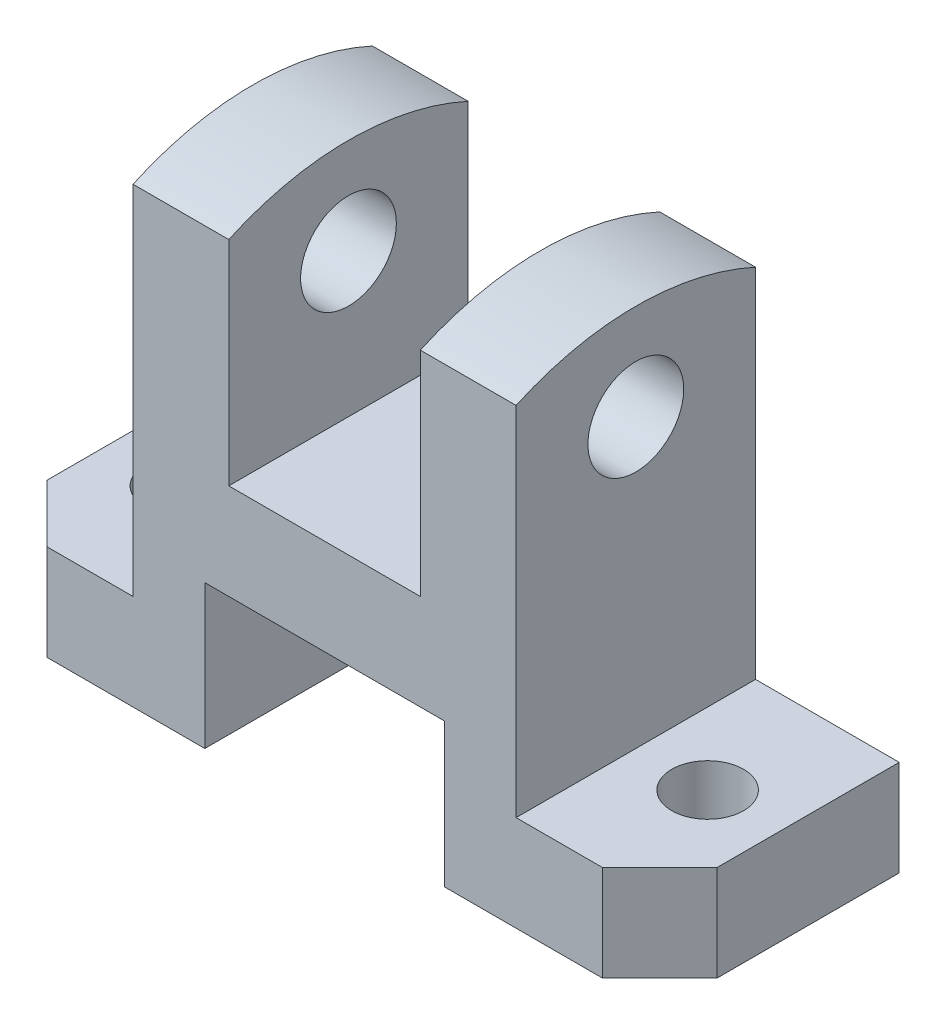
ISO-10303-21;
HEADER;
FILE_DESCRIPTION(('STEP AP214'),'2;1');
FILE_NAME('part.step','',(''),(''),'','','');
FILE_SCHEMA(('AUTOMOTIVE_DESIGN { 1 0 10303 214 1 1 1 1 }'));
ENDSEC;
DATA;
#1=APPLICATION_CONTEXT('core data for automotive mechanical design processes');
#2=APPLICATION_PROTOCOL_DEFINITION('international standard','automotive_design',2000,#1);
#3=PRODUCT_CONTEXT('',#1,'mechanical');
#4=PRODUCT('Part','Part','',(#3));
#5=PRODUCT_RELATED_PRODUCT_CATEGORY('part','',(#4));
#6=PRODUCT_DEFINITION_FORMATION('','',#4);
#7=PRODUCT_DEFINITION_CONTEXT('part definition',#1,'design');
#8=PRODUCT_DEFINITION('design','',#6,#7);
#9=PRODUCT_DEFINITION_SHAPE('','',#8);
#10=(LENGTH_UNIT() NAMED_UNIT(*) SI_UNIT(.MILLI.,.METRE.));
#11=(NAMED_UNIT(*) PLANE_ANGLE_UNIT() SI_UNIT($,.RADIAN.));
#12=(NAMED_UNIT(*) SI_UNIT($,.STERADIAN.) SOLID_ANGLE_UNIT());
#13=UNCERTAINTY_MEASURE_WITH_UNIT(LENGTH_MEASURE(1.E-05),#10,'distance_accuracy_value','');
#14=(GEOMETRIC_REPRESENTATION_CONTEXT(3) GLOBAL_UNCERTAINTY_ASSIGNED_CONTEXT((#13)) GLOBAL_UNIT_ASSIGNED_CONTEXT((#10,
#11,#12)) REPRESENTATION_CONTEXT('',''));
#15=CARTESIAN_POINT('',(0.,0.,0.));
#16=DIRECTION('',(0.,0.,1.));
#17=DIRECTION('',(1.,0.,0.));
#18=AXIS2_PLACEMENT_3D('',#15,#16,#17);
#19=CARTESIAN_POINT('',(41.275,0.,31.75));
#20=DIRECTION('',(-1.,0.,0.));
#21=DIRECTION('',(0.,0.,1.));
#22=AXIS2_PLACEMENT_3D('',#19,#20,#21);
#23=PLANE('',#22);
#24=CARTESIAN_POINT('',(41.275,-12.7,15.875));
#25=DIRECTION('',(1.,0.,0.));
#26=DIRECTION('',(0.,0.,-1.));
#27=AXIS2_PLACEMENT_3D('',#24,#25,#26);
#28=CIRCLE('',#27,6.35);
#29=CARTESIAN_POINT('',(41.275,-12.7,9.525));
#30=VERTEX_POINT('',#29);
#31=EDGE_CURVE('E161',#30,#30,#28,.T.);
#32=ORIENTED_EDGE('',*,*,#31,.F.);
#33=EDGE_LOOP('',(#32));
#34=FACE_BOUND('',#33,.T.);
#35=CARTESIAN_POINT('',(41.275,-38.1,15.875));
#36=DIRECTION('',(1.,0.,0.));
#37=DIRECTION('',(0.,0.,-1.));
#38=AXIS2_PLACEMENT_3D('',#35,#36,#37);
#39=CIRCLE('',#38,38.1);
#40=CARTESIAN_POINT('',(41.275,-3.46483903603161,31.75));
#41=VERTEX_POINT('',#40);
#42=CARTESIAN_POINT('',(41.275,-3.46483903603161,0.));
#43=VERTEX_POINT('',#42);
#44=EDGE_CURVE('E54',#41,#43,#39,.F.);
#45=ORIENTED_EDGE('',*,*,#44,.F.);
#46=DIRECTION('',(0.,1.,0.));
#47=VECTOR('',#46,1.);
#48=CARTESIAN_POINT('',(41.275,0.,31.75));
#49=LINE('',#48,#47);
#50=CARTESIAN_POINT('',(41.275,-50.8,31.75));
#51=VERTEX_POINT('',#50);
#52=EDGE_CURVE('E157',#51,#41,#49,.T.);
#53=ORIENTED_EDGE('',*,*,#52,.F.);
#54=DIRECTION('',(0.,0.,-1.));
#55=VECTOR('',#54,1.);
#56=CARTESIAN_POINT('',(41.275,-50.8,31.75));
#57=LINE('',#56,#55);
#58=CARTESIAN_POINT('',(41.275,-50.8,0.));
#59=VERTEX_POINT('',#58);
#60=EDGE_CURVE('E211',#51,#59,#57,.T.);
#61=ORIENTED_EDGE('',*,*,#60,.T.);
#62=DIRECTION('',(0.,1.,0.));
#63=VECTOR('',#62,1.);
#64=CARTESIAN_POINT('',(41.275,0.,0.));
#65=LINE('',#64,#63);
#66=EDGE_CURVE('E160',#59,#43,#65,.T.);
#67=ORIENTED_EDGE('',*,*,#66,.T.);
#68=EDGE_LOOP('',(#45,#53,#61,#67));
#69=FACE_BOUND('',#68,.T.);
#70=ADVANCED_FACE('F33',(#34,#69),#23,.F.);
#71=CARTESIAN_POINT('',(28.575,0.,31.75));
#72=DIRECTION('',(1.,0.,0.));
#73=DIRECTION('',(0.,0.,-1.));
#74=AXIS2_PLACEMENT_3D('',#71,#72,#73);
#75=PLANE('',#74);
#76=CARTESIAN_POINT('',(28.575,-12.7,15.875));
#77=DIRECTION('',(1.,0.,0.));
#78=DIRECTION('',(0.,0.,-1.));
#79=AXIS2_PLACEMENT_3D('',#76,#77,#78);
#80=CIRCLE('',#79,6.35);
#81=CARTESIAN_POINT('',(28.575,-12.7,9.525));
#82=VERTEX_POINT('',#81);
#83=EDGE_CURVE('E287',#82,#82,#80,.T.);
#84=ORIENTED_EDGE('',*,*,#83,.T.);
#85=EDGE_LOOP('',(#84));
#86=FACE_BOUND('',#85,.T.);
#87=DIRECTION('',(0.,-1.,0.));
#88=VECTOR('',#87,1.);
#89=CARTESIAN_POINT('',(28.575,0.,31.75));
#90=LINE('',#89,#88);
#91=CARTESIAN_POINT('',(28.575,-3.46483903603161,31.75));
#92=VERTEX_POINT('',#91);
#93=CARTESIAN_POINT('',(28.575,-31.75,31.75));
#94=VERTEX_POINT('',#93);
#95=EDGE_CURVE('E175',#92,#94,#90,.T.);
#96=ORIENTED_EDGE('',*,*,#95,.F.);
#97=CARTESIAN_POINT('',(28.575,-38.1,15.875));
#98=DIRECTION('',(1.,0.,0.));
#99=DIRECTION('',(0.,0.,-1.));
#100=AXIS2_PLACEMENT_3D('',#97,#98,#99);
#101=CIRCLE('',#100,38.1);
#102=CARTESIAN_POINT('',(28.575,-3.46483903603161,0.));
#103=VERTEX_POINT('',#102);
#104=EDGE_CURVE('E166',#92,#103,#101,.F.);
#105=ORIENTED_EDGE('',*,*,#104,.T.);
#106=DIRECTION('',(0.,-1.,0.));
#107=VECTOR('',#106,1.);
#108=CARTESIAN_POINT('',(28.575,0.,0.));
#109=LINE('',#108,#107);
#110=CARTESIAN_POINT('',(28.575,-31.75,0.));
#111=VERTEX_POINT('',#110);
#112=EDGE_CURVE('E213',#103,#111,#109,.T.);
#113=ORIENTED_EDGE('',*,*,#112,.T.);
#114=DIRECTION('',(0.,0.,-1.));
#115=VECTOR('',#114,1.);
#116=CARTESIAN_POINT('',(28.575,-31.75,31.75));
#117=LINE('',#116,#115);
#118=EDGE_CURVE('E268',#94,#111,#117,.T.);
#119=ORIENTED_EDGE('',*,*,#118,.F.);
#120=EDGE_LOOP('',(#96,#105,#113,#119));
#121=FACE_BOUND('',#120,.T.);
#122=ADVANCED_FACE('F356',(#86,#121),#75,.F.);
#123=CARTESIAN_POINT('',(3.175,0.,31.75));
#124=DIRECTION('',(1.,0.,0.));
#125=DIRECTION('',(0.,0.,-1.));
#126=AXIS2_PLACEMENT_3D('',#123,#124,#125);
#127=PLANE('',#126);
#128=CARTESIAN_POINT('',(3.175,-12.7,15.875));
#129=DIRECTION('',(1.,0.,0.));
#130=DIRECTION('',(0.,0.,-1.));
#131=AXIS2_PLACEMENT_3D('',#128,#129,#130);
#132=CIRCLE('',#131,6.35);
#133=CARTESIAN_POINT('',(3.175,-12.7,9.525));
#134=VERTEX_POINT('',#133);
#135=EDGE_CURVE('E283',#134,#134,#132,.T.);
#136=ORIENTED_EDGE('',*,*,#135,.F.);
#137=EDGE_LOOP('',(#136));
#138=FACE_BOUND('',#137,.T.);
#139=CARTESIAN_POINT('',(3.175,-38.1,15.875));
#140=DIRECTION('',(1.,0.,0.));
#141=DIRECTION('',(0.,0.,-1.));
#142=AXIS2_PLACEMENT_3D('',#139,#140,#141);
#143=CIRCLE('',#142,38.1);
#144=CARTESIAN_POINT('',(3.175,-3.46483903603161,31.75));
#145=VERTEX_POINT('',#144);
#146=CARTESIAN_POINT('',(3.175,-3.46483903603161,0.));
#147=VERTEX_POINT('',#146);
#148=EDGE_CURVE('E46',#145,#147,#143,.F.);
#149=ORIENTED_EDGE('',*,*,#148,.F.);
#150=DIRECTION('',(0.,-1.,0.));
#151=VECTOR('',#150,1.);
#152=CARTESIAN_POINT('',(3.175,0.,31.75));
#153=LINE('',#152,#151);
#154=CARTESIAN_POINT('',(3.175,-31.75,31.75));
#155=VERTEX_POINT('',#154);
#156=EDGE_CURVE('E189',#145,#155,#153,.T.);
#157=ORIENTED_EDGE('',*,*,#156,.T.);
#158=DIRECTION('',(0.,0.,-1.));
#159=VECTOR('',#158,1.);
#160=CARTESIAN_POINT('',(3.175,-31.75,31.75));
#161=LINE('',#160,#159);
#162=CARTESIAN_POINT('',(3.175,-31.75,0.));
#163=VERTEX_POINT('',#162);
#164=EDGE_CURVE('E265',#155,#163,#161,.T.);
#165=ORIENTED_EDGE('',*,*,#164,.T.);
#166=DIRECTION('',(0.,-1.,0.));
#167=VECTOR('',#166,1.);
#168=CARTESIAN_POINT('',(3.175,0.,0.));
#169=LINE('',#168,#167);
#170=EDGE_CURVE('E218',#147,#163,#169,.T.);
#171=ORIENTED_EDGE('',*,*,#170,.F.);
#172=EDGE_LOOP('',(#149,#157,#165,#171));
#173=FACE_BOUND('',#172,.T.);
#174=ADVANCED_FACE('F364',(#138,#173),#127,.T.);
#175=CARTESIAN_POINT('',(-9.525,0.,31.75));
#176=DIRECTION('',(1.,0.,0.));
#177=DIRECTION('',(0.,0.,-1.));
#178=AXIS2_PLACEMENT_3D('',#175,#176,#177);
#179=PLANE('',#178);
#180=CARTESIAN_POINT('',(-9.525,-12.7,15.875));
#181=DIRECTION('',(1.,0.,0.));
#182=DIRECTION('',(0.,0.,-1.));
#183=AXIS2_PLACEMENT_3D('',#180,#181,#182);
#184=CIRCLE('',#183,6.35);
#185=CARTESIAN_POINT('',(-9.525,-12.7,9.525));
#186=VERTEX_POINT('',#185);
#187=EDGE_CURVE('E281',#186,#186,#184,.T.);
#188=ORIENTED_EDGE('',*,*,#187,.T.);
#189=EDGE_LOOP('',(#188));
#190=FACE_BOUND('',#189,.T.);
#191=DIRECTION('',(0.,-1.,0.));
#192=VECTOR('',#191,1.);
#193=CARTESIAN_POINT('',(-9.525,0.,31.75));
#194=LINE('',#193,#192);
#195=CARTESIAN_POINT('',(-9.525,-3.46483903603161,31.75));
#196=VERTEX_POINT('',#195);
#197=CARTESIAN_POINT('',(-9.525,-50.8,31.75));
#198=VERTEX_POINT('',#197);
#199=EDGE_CURVE('E191',#196,#198,#194,.T.);
#200=ORIENTED_EDGE('',*,*,#199,.F.);
#201=CARTESIAN_POINT('',(-9.525,-38.1,15.875));
#202=DIRECTION('',(1.,0.,0.));
#203=DIRECTION('',(0.,0.,-1.));
#204=AXIS2_PLACEMENT_3D('',#201,#202,#203);
#205=CIRCLE('',#204,38.1);
#206=CARTESIAN_POINT('',(-9.525,-3.46483903603161,0.));
#207=VERTEX_POINT('',#206);
#208=EDGE_CURVE('E292',#196,#207,#205,.F.);
#209=ORIENTED_EDGE('',*,*,#208,.T.);
#210=DIRECTION('',(0.,-1.,0.));
#211=VECTOR('',#210,1.);
#212=CARTESIAN_POINT('',(-9.525,0.,0.));
#213=LINE('',#212,#211);
#214=CARTESIAN_POINT('',(-9.525,-50.8,0.));
#215=VERTEX_POINT('',#214);
#216=EDGE_CURVE('E220',#207,#215,#213,.T.);
#217=ORIENTED_EDGE('',*,*,#216,.T.);
#218=DIRECTION('',(0.,0.,-1.));
#219=VECTOR('',#218,1.);
#220=CARTESIAN_POINT('',(-9.525,-50.8,31.75));
#221=LINE('',#220,#219);
#222=EDGE_CURVE('E262',#198,#215,#221,.T.);
#223=ORIENTED_EDGE('',*,*,#222,.F.);
#224=EDGE_LOOP('',(#200,#209,#217,#223));
#225=FACE_BOUND('',#224,.T.);
#226=ADVANCED_FACE('F384',(#190,#225),#179,.F.);
#227=CARTESIAN_POINT('',(0.,-31.75,31.75));
#228=DIRECTION('',(0.,1.,0.));
#229=DIRECTION('',(0.,0.,1.));
#230=AXIS2_PLACEMENT_3D('',#227,#228,#229);
#231=PLANE('',#230);
#232=DIRECTION('',(1.,0.,0.));
#233=VECTOR('',#232,1.);
#234=CARTESIAN_POINT('',(0.,-31.75,0.));
#235=LINE('',#234,#233);
#236=EDGE_CURVE('E215',#163,#111,#235,.T.);
#237=ORIENTED_EDGE('',*,*,#236,.F.);
#238=ORIENTED_EDGE('',*,*,#164,.F.);
#239=DIRECTION('',(1.,0.,0.));
#240=VECTOR('',#239,1.);
#241=CARTESIAN_POINT('',(0.,-31.75,31.75));
#242=LINE('',#241,#240);
#243=EDGE_CURVE('E178',#155,#94,#242,.T.);
#244=ORIENTED_EDGE('',*,*,#243,.T.);
#245=ORIENTED_EDGE('',*,*,#118,.T.);
#246=EDGE_LOOP('',(#237,#238,#244,#245));
#247=FACE_BOUND('',#246,.T.);
#248=ADVANCED_FACE('F358',(#247),#231,.T.);
#249=CARTESIAN_POINT('',(0.,-50.8,31.75));
#250=DIRECTION('',(0.,-1.,0.));
#251=DIRECTION('',(0.,0.,-1.));
#252=AXIS2_PLACEMENT_3D('',#249,#250,#251);
#253=PLANE('',#252);
#254=CARTESIAN_POINT('',(-19.05,-50.8,15.875));
#255=DIRECTION('',(0.,1.,0.));
#256=DIRECTION('',(0.,0.,1.));
#257=AXIS2_PLACEMENT_3D('',#254,#255,#256);
#258=CIRCLE('',#257,4.7625);
#259=CARTESIAN_POINT('',(-19.05,-50.8,20.6375));
#260=VERTEX_POINT('',#259);
#261=EDGE_CURVE('E299',#260,#260,#258,.T.);
#262=ORIENTED_EDGE('',*,*,#261,.F.);
#263=EDGE_LOOP('',(#262));
#264=FACE_BOUND('',#263,.T.);
#265=DIRECTION('',(0.,0.,-1.));
#266=VECTOR('',#265,1.);
#267=CARTESIAN_POINT('',(-28.575,-50.8,31.75));
#268=LINE('',#267,#266);
#269=CARTESIAN_POINT('',(-28.575,-50.8,24.13));
#270=VERTEX_POINT('',#269);
#271=CARTESIAN_POINT('',(-28.575,-50.8,0.));
#272=VERTEX_POINT('',#271);
#273=EDGE_CURVE('E260',#270,#272,#268,.T.);
#274=ORIENTED_EDGE('',*,*,#273,.F.);
#275=DIRECTION('',(-0.707106781186548,0.,-0.707106781186547));
#276=VECTOR('',#275,1.);
#277=CARTESIAN_POINT('',(-20.955,-50.8,31.75));
#278=LINE('',#277,#276);
#279=CARTESIAN_POINT('',(-20.955,-50.8,31.75));
#280=VERTEX_POINT('',#279);
#281=EDGE_CURVE('E306',#280,#270,#278,.T.);
#282=ORIENTED_EDGE('',*,*,#281,.F.);
#283=DIRECTION('',(-1.,0.,0.));
#284=VECTOR('',#283,1.);
#285=CARTESIAN_POINT('',(0.,-50.8,31.75));
#286=LINE('',#285,#284);
#287=EDGE_CURVE('E193',#198,#280,#286,.T.);
#288=ORIENTED_EDGE('',*,*,#287,.F.);
#289=ORIENTED_EDGE('',*,*,#222,.T.);
#290=DIRECTION('',(-1.,0.,0.));
#291=VECTOR('',#290,1.);
#292=CARTESIAN_POINT('',(0.,-50.8,0.));
#293=LINE('',#292,#291);
#294=EDGE_CURVE('E222',#215,#272,#293,.T.);
#295=ORIENTED_EDGE('',*,*,#294,.T.);
#296=EDGE_LOOP('',(#274,#282,#288,#289,#295));
#297=FACE_BOUND('',#296,.T.);
#298=ADVANCED_FACE('F389',(#264,#297),#253,.F.);
#299=CARTESIAN_POINT('',(-28.575,0.,31.75));
#300=DIRECTION('',(-1.,0.,0.));
#301=DIRECTION('',(0.,-1.,0.));
#302=AXIS2_PLACEMENT_3D('',#299,#300,#301);
#303=PLANE('',#302);
#304=DIRECTION('',(0.,1.,0.));
#305=VECTOR('',#304,1.);
#306=CARTESIAN_POINT('',(-28.575,-82.55,24.13));
#307=LINE('',#306,#305);
#308=CARTESIAN_POINT('',(-28.575,-63.5,24.13));
#309=VERTEX_POINT('',#308);
#310=EDGE_CURVE('E308',#309,#270,#307,.T.);
#311=ORIENTED_EDGE('',*,*,#310,.T.);
#312=ORIENTED_EDGE('',*,*,#273,.T.);
#313=DIRECTION('',(0.,1.,0.));
#314=VECTOR('',#313,1.);
#315=CARTESIAN_POINT('',(-28.575,0.,0.));
#316=LINE('',#315,#314);
#317=CARTESIAN_POINT('',(-28.575,-63.5,0.));
#318=VERTEX_POINT('',#317);
#319=EDGE_CURVE('E225',#318,#272,#316,.T.);
#320=ORIENTED_EDGE('',*,*,#319,.F.);
#321=DIRECTION('',(0.,0.,-1.));
#322=VECTOR('',#321,1.);
#323=CARTESIAN_POINT('',(-28.575,-63.5,31.75));
#324=LINE('',#323,#322);
#325=EDGE_CURVE('E258',#309,#318,#324,.T.);
#326=ORIENTED_EDGE('',*,*,#325,.F.);
#327=EDGE_LOOP('',(#311,#312,#320,#326));
#328=FACE_BOUND('',#327,.T.);
#329=ADVANCED_FACE('F395',(#328),#303,.T.);
#330=CARTESIAN_POINT('',(0.,-63.5,31.75));
#331=DIRECTION('',(0.,-1.,0.));
#332=DIRECTION('',(1.,0.,0.));
#333=AXIS2_PLACEMENT_3D('',#330,#331,#332);
#334=PLANE('',#333);
#335=CARTESIAN_POINT('',(-19.05,-63.5,15.875));
#336=DIRECTION('',(0.,-1.,0.));
#337=DIRECTION('',(1.,0.,0.));
#338=AXIS2_PLACEMENT_3D('',#335,#336,#337);
#339=CIRCLE('',#338,4.7625);
#340=CARTESIAN_POINT('',(-14.2875,-63.5,15.875));
#341=VERTEX_POINT('',#340);
#342=EDGE_CURVE('E276',#341,#341,#339,.T.);
#343=ORIENTED_EDGE('',*,*,#342,.F.);
#344=EDGE_LOOP('',(#343));
#345=FACE_BOUND('',#344,.T.);
#346=DIRECTION('',(0.707106781186548,0.,0.707106781186547));
#347=VECTOR('',#346,1.);
#348=CARTESIAN_POINT('',(-10.4775,-63.5,42.2275));
#349=LINE('',#348,#347);
#350=CARTESIAN_POINT('',(-20.955,-63.5,31.75));
#351=VERTEX_POINT('',#350);
#352=EDGE_CURVE('E184',#309,#351,#349,.T.);
#353=ORIENTED_EDGE('',*,*,#352,.F.);
#354=ORIENTED_EDGE('',*,*,#325,.T.);
#355=DIRECTION('',(-1.,0.,0.));
#356=VECTOR('',#355,1.);
#357=CARTESIAN_POINT('',(0.,-63.5,0.));
#358=LINE('',#357,#356);
#359=CARTESIAN_POINT('',(0.,-63.5,0.));
#360=VERTEX_POINT('',#359);
#361=EDGE_CURVE('E228',#360,#318,#358,.T.);
#362=ORIENTED_EDGE('',*,*,#361,.F.);
#363=DIRECTION('',(0.,0.,-1.));
#364=VECTOR('',#363,1.);
#365=CARTESIAN_POINT('',(0.,-63.5,31.75));
#366=LINE('',#365,#364);
#367=CARTESIAN_POINT('',(0.,-63.5,31.75));
#368=VERTEX_POINT('',#367);
#369=EDGE_CURVE('E256',#368,#360,#366,.T.);
#370=ORIENTED_EDGE('',*,*,#369,.F.);
#371=DIRECTION('',(-1.,0.,0.));
#372=VECTOR('',#371,1.);
#373=CARTESIAN_POINT('',(0.,-63.5,31.75));
#374=LINE('',#373,#372);
#375=EDGE_CURVE('E196',#368,#351,#374,.T.);
#376=ORIENTED_EDGE('',*,*,#375,.T.);
#377=EDGE_LOOP('',(#353,#354,#362,#370,#376));
#378=FACE_BOUND('',#377,.T.);
#379=ADVANCED_FACE('F328',(#345,#378),#334,.T.);
#380=CARTESIAN_POINT('',(0.,0.,31.75));
#381=DIRECTION('',(1.,0.,0.));
#382=DIRECTION('',(0.,1.,0.));
#383=AXIS2_PLACEMENT_3D('',#380,#381,#382);
#384=PLANE('',#383);
#385=DIRECTION('',(0.,-1.,0.));
#386=VECTOR('',#385,1.);
#387=CARTESIAN_POINT('',(0.,0.,0.));
#388=LINE('',#387,#386);
#389=CARTESIAN_POINT('',(0.,-44.45,0.));
#390=VERTEX_POINT('',#389);
#391=EDGE_CURVE('E231',#390,#360,#388,.T.);
#392=ORIENTED_EDGE('',*,*,#391,.F.);
#393=DIRECTION('',(0.,0.,-1.));
#394=VECTOR('',#393,1.);
#395=CARTESIAN_POINT('',(0.,-44.45,31.75));
#396=LINE('',#395,#394);
#397=CARTESIAN_POINT('',(0.,-44.45,31.75));
#398=VERTEX_POINT('',#397);
#399=EDGE_CURVE('E254',#398,#390,#396,.T.);
#400=ORIENTED_EDGE('',*,*,#399,.F.);
#401=DIRECTION('',(0.,-1.,0.));
#402=VECTOR('',#401,1.);
#403=CARTESIAN_POINT('',(0.,0.,31.75));
#404=LINE('',#403,#402);
#405=EDGE_CURVE('E199',#398,#368,#404,.T.);
#406=ORIENTED_EDGE('',*,*,#405,.T.);
#407=ORIENTED_EDGE('',*,*,#369,.T.);
#408=EDGE_LOOP('',(#392,#400,#406,#407));
#409=FACE_BOUND('',#408,.T.);
#410=ADVANCED_FACE('F332',(#409),#384,.T.);
#411=CARTESIAN_POINT('',(0.,-44.45,31.75));
#412=DIRECTION('',(0.,1.,0.));
#413=DIRECTION('',(-1.,0.,0.));
#414=AXIS2_PLACEMENT_3D('',#411,#412,#413);
#415=PLANE('',#414);
#416=DIRECTION('',(1.,0.,0.));
#417=VECTOR('',#416,1.);
#418=CARTESIAN_POINT('',(0.,-44.45,0.));
#419=LINE('',#418,#417);
#420=CARTESIAN_POINT('',(31.75,-44.45,0.));
#421=VERTEX_POINT('',#420);
#422=EDGE_CURVE('E234',#390,#421,#419,.T.);
#423=ORIENTED_EDGE('',*,*,#422,.T.);
#424=DIRECTION('',(0.,0.,-1.));
#425=VECTOR('',#424,1.);
#426=CARTESIAN_POINT('',(31.75,-44.45,31.75));
#427=LINE('',#426,#425);
#428=CARTESIAN_POINT('',(31.75,-44.45,31.75));
#429=VERTEX_POINT('',#428);
#430=EDGE_CURVE('E252',#429,#421,#427,.T.);
#431=ORIENTED_EDGE('',*,*,#430,.F.);
#432=DIRECTION('',(1.,0.,0.));
#433=VECTOR('',#432,1.);
#434=CARTESIAN_POINT('',(0.,-44.45,31.75));
#435=LINE('',#434,#433);
#436=EDGE_CURVE('E202',#398,#429,#435,.T.);
#437=ORIENTED_EDGE('',*,*,#436,.F.);
#438=ORIENTED_EDGE('',*,*,#399,.T.);
#439=EDGE_LOOP('',(#423,#431,#437,#438));
#440=FACE_BOUND('',#439,.T.);
#441=ADVANCED_FACE('F337',(#440),#415,.F.);
#442=CARTESIAN_POINT('',(31.75,0.,31.75));
#443=DIRECTION('',(-1.,0.,0.));
#444=DIRECTION('',(0.,-1.,0.));
#445=AXIS2_PLACEMENT_3D('',#442,#443,#444);
#446=PLANE('',#445);
#447=DIRECTION('',(0.,1.,0.));
#448=VECTOR('',#447,1.);
#449=CARTESIAN_POINT('',(31.75,0.,0.));
#450=LINE('',#449,#448);
#451=CARTESIAN_POINT('',(31.75,-63.5,0.));
#452=VERTEX_POINT('',#451);
#453=EDGE_CURVE('E237',#452,#421,#450,.T.);
#454=ORIENTED_EDGE('',*,*,#453,.F.);
#455=DIRECTION('',(0.,0.,-1.));
#456=VECTOR('',#455,1.);
#457=CARTESIAN_POINT('',(31.75,-63.5,31.75));
#458=LINE('',#457,#456);
#459=CARTESIAN_POINT('',(31.75,-63.5,31.75));
#460=VERTEX_POINT('',#459);
#461=EDGE_CURVE('E250',#460,#452,#458,.T.);
#462=ORIENTED_EDGE('',*,*,#461,.F.);
#463=DIRECTION('',(0.,1.,0.));
#464=VECTOR('',#463,1.);
#465=CARTESIAN_POINT('',(31.75,0.,31.75));
#466=LINE('',#465,#464);
#467=EDGE_CURVE('E204',#460,#429,#466,.T.);
#468=ORIENTED_EDGE('',*,*,#467,.T.);
#469=ORIENTED_EDGE('',*,*,#430,.T.);
#470=EDGE_LOOP('',(#454,#462,#468,#469));
#471=FACE_BOUND('',#470,.T.);
#472=ADVANCED_FACE('F341',(#471),#446,.T.);
#473=CARTESIAN_POINT('',(0.,-63.5,31.75));
#474=DIRECTION('',(0.,1.,0.));
#475=DIRECTION('',(0.,0.,1.));
#476=AXIS2_PLACEMENT_3D('',#473,#474,#475);
#477=PLANE('',#476);
#478=CARTESIAN_POINT('',(50.8,-63.5,15.875));
#479=DIRECTION('',(0.,1.,0.));
#480=DIRECTION('',(0.,0.,1.));
#481=AXIS2_PLACEMENT_3D('',#478,#479,#480);
#482=CIRCLE('',#481,4.7625);
#483=CARTESIAN_POINT('',(50.8,-63.5,20.6375));
#484=VERTEX_POINT('',#483);
#485=EDGE_CURVE('E280',#484,#484,#482,.T.);
#486=ORIENTED_EDGE('',*,*,#485,.T.);
#487=EDGE_LOOP('',(#486));
#488=FACE_BOUND('',#487,.T.);
#489=DIRECTION('',(0.,0.,-1.));
#490=VECTOR('',#489,1.);
#491=CARTESIAN_POINT('',(60.325,-63.5,31.75));
#492=LINE('',#491,#490);
#493=CARTESIAN_POINT('',(60.325,-63.5,24.13));
#494=VERTEX_POINT('',#493);
#495=CARTESIAN_POINT('',(60.325,-63.5,0.));
#496=VERTEX_POINT('',#495);
#497=EDGE_CURVE('E248',#494,#496,#492,.T.);
#498=ORIENTED_EDGE('',*,*,#497,.F.);
#499=DIRECTION('',(-0.707106781186548,0.,0.707106781186547));
#500=VECTOR('',#499,1.);
#501=CARTESIAN_POINT('',(26.3525,-63.5,58.1025));
#502=LINE('',#501,#500);
#503=CARTESIAN_POINT('',(52.705,-63.5,31.75));
#504=VERTEX_POINT('',#503);
#505=EDGE_CURVE('E312',#494,#504,#502,.T.);
#506=ORIENTED_EDGE('',*,*,#505,.T.);
#507=DIRECTION('',(1.,0.,0.));
#508=VECTOR('',#507,1.);
#509=CARTESIAN_POINT('',(0.,-63.5,31.75));
#510=LINE('',#509,#508);
#511=EDGE_CURVE('E207',#460,#504,#510,.T.);
#512=ORIENTED_EDGE('',*,*,#511,.F.);
#513=ORIENTED_EDGE('',*,*,#461,.T.);
#514=DIRECTION('',(1.,0.,0.));
#515=VECTOR('',#514,1.);
#516=CARTESIAN_POINT('',(0.,-63.5,0.));
#517=LINE('',#516,#515);
#518=EDGE_CURVE('E240',#452,#496,#517,.T.);
#519=ORIENTED_EDGE('',*,*,#518,.T.);
#520=EDGE_LOOP('',(#498,#506,#512,#513,#519));
#521=FACE_BOUND('',#520,.T.);
#522=ADVANCED_FACE('F343',(#488,#521),#477,.F.);
#523=CARTESIAN_POINT('',(60.325,0.,31.75));
#524=DIRECTION('',(-1.,0.,0.));
#525=DIRECTION('',(0.,-1.,0.));
#526=AXIS2_PLACEMENT_3D('',#523,#524,#525);
#527=PLANE('',#526);
#528=DIRECTION('',(0.,0.,-1.));
#529=VECTOR('',#528,1.);
#530=CARTESIAN_POINT('',(60.325,-50.8,31.75));
#531=LINE('',#530,#529);
#532=CARTESIAN_POINT('',(60.325,-50.8,24.13));
#533=VERTEX_POINT('',#532);
#534=CARTESIAN_POINT('',(60.325,-50.8,0.));
#535=VERTEX_POINT('',#534);
#536=EDGE_CURVE('E246',#533,#535,#531,.T.);
#537=ORIENTED_EDGE('',*,*,#536,.F.);
#538=DIRECTION('',(0.,1.,0.));
#539=VECTOR('',#538,1.);
#540=CARTESIAN_POINT('',(60.325,-82.55,24.13));
#541=LINE('',#540,#539);
#542=EDGE_CURVE('E309',#494,#533,#541,.T.);
#543=ORIENTED_EDGE('',*,*,#542,.F.);
#544=ORIENTED_EDGE('',*,*,#497,.T.);
#545=DIRECTION('',(0.,1.,0.));
#546=VECTOR('',#545,1.);
#547=CARTESIAN_POINT('',(60.325,0.,0.));
#548=LINE('',#547,#546);
#549=EDGE_CURVE('E181',#496,#535,#548,.T.);
#550=ORIENTED_EDGE('',*,*,#549,.T.);
#551=EDGE_LOOP('',(#537,#543,#544,#550));
#552=FACE_BOUND('',#551,.T.);
#553=ADVANCED_FACE('F411',(#552),#527,.F.);
#554=CARTESIAN_POINT('',(0.,-50.8,31.75));
#555=DIRECTION('',(0.,1.,0.));
#556=DIRECTION('',(0.,0.,1.));
#557=AXIS2_PLACEMENT_3D('',#554,#555,#556);
#558=PLANE('',#557);
#559=CARTESIAN_POINT('',(50.8,-50.8,15.875));
#560=DIRECTION('',(0.,1.,0.));
#561=DIRECTION('',(0.,0.,1.));
#562=AXIS2_PLACEMENT_3D('',#559,#560,#561);
#563=CIRCLE('',#562,4.7625);
#564=CARTESIAN_POINT('',(50.8,-50.8,20.6375));
#565=VERTEX_POINT('',#564);
#566=EDGE_CURVE('E298',#565,#565,#563,.T.);
#567=ORIENTED_EDGE('',*,*,#566,.F.);
#568=EDGE_LOOP('',(#567));
#569=FACE_BOUND('',#568,.T.);
#570=DIRECTION('',(-0.707106781186548,0.,0.707106781186547));
#571=VECTOR('',#570,1.);
#572=CARTESIAN_POINT('',(52.705,-50.8,31.75));
#573=LINE('',#572,#571);
#574=CARTESIAN_POINT('',(52.705,-50.8,31.75));
#575=VERTEX_POINT('',#574);
#576=EDGE_CURVE('E279',#533,#575,#573,.T.);
#577=ORIENTED_EDGE('',*,*,#576,.F.);
#578=ORIENTED_EDGE('',*,*,#536,.T.);
#579=DIRECTION('',(1.,0.,0.));
#580=VECTOR('',#579,1.);
#581=CARTESIAN_POINT('',(0.,-50.8,0.));
#582=LINE('',#581,#580);
#583=EDGE_CURVE('E176',#59,#535,#582,.T.);
#584=ORIENTED_EDGE('',*,*,#583,.F.);
#585=ORIENTED_EDGE('',*,*,#60,.F.);
#586=DIRECTION('',(1.,0.,0.));
#587=VECTOR('',#586,1.);
#588=CARTESIAN_POINT('',(0.,-50.8,31.75));
#589=LINE('',#588,#587);
#590=EDGE_CURVE('E174',#51,#575,#589,.T.);
#591=ORIENTED_EDGE('',*,*,#590,.T.);
#592=EDGE_LOOP('',(#577,#578,#584,#585,#591));
#593=FACE_BOUND('',#592,.T.);
#594=ADVANCED_FACE('F347',(#569,#593),#558,.T.);
#595=CARTESIAN_POINT('',(0.,0.,31.75));
#596=DIRECTION('',(0.,0.,1.));
#597=DIRECTION('',(1.,0.,0.));
#598=AXIS2_PLACEMENT_3D('',#595,#596,#597);
#599=PLANE('',#598);
#600=DIRECTION('',(1.,0.,0.));
#601=VECTOR('',#600,1.);
#602=CARTESIAN_POINT('',(-28.575,-3.46483903603161,31.75));
#603=LINE('',#602,#601);
#604=EDGE_CURVE('E11',#196,#145,#603,.T.);
#605=ORIENTED_EDGE('',*,*,#604,.F.);
#606=ORIENTED_EDGE('',*,*,#199,.T.);
#607=ORIENTED_EDGE('',*,*,#287,.T.);
#608=DIRECTION('',(0.,1.,0.));
#609=VECTOR('',#608,1.);
#610=CARTESIAN_POINT('',(-20.955,0.,31.75));
#611=LINE('',#610,#609);
#612=EDGE_CURVE('E273',#351,#280,#611,.T.);
#613=ORIENTED_EDGE('',*,*,#612,.F.);
#614=ORIENTED_EDGE('',*,*,#375,.F.);
#615=ORIENTED_EDGE('',*,*,#405,.F.);
#616=ORIENTED_EDGE('',*,*,#436,.T.);
#617=ORIENTED_EDGE('',*,*,#467,.F.);
#618=ORIENTED_EDGE('',*,*,#511,.T.);
#619=DIRECTION('',(0.,-1.,0.));
#620=VECTOR('',#619,1.);
#621=CARTESIAN_POINT('',(52.705,0.,31.75));
#622=LINE('',#621,#620);
#623=EDGE_CURVE('E271',#575,#504,#622,.T.);
#624=ORIENTED_EDGE('',*,*,#623,.F.);
#625=ORIENTED_EDGE('',*,*,#590,.F.);
#626=ORIENTED_EDGE('',*,*,#52,.T.);
#627=EDGE_CURVE('E36',#92,#41,#603,.T.);
#628=ORIENTED_EDGE('',*,*,#627,.F.);
#629=ORIENTED_EDGE('',*,*,#95,.T.);
#630=ORIENTED_EDGE('',*,*,#243,.F.);
#631=ORIENTED_EDGE('',*,*,#156,.F.);
#632=EDGE_LOOP('',(#605,#606,#607,#613,#614,#615,#616,#617,#618,#624,#625,#626,#628,#629,#630,#631));
#633=FACE_BOUND('',#632,.T.);
#634=ADVANCED_FACE('F171',(#633),#599,.T.);
#635=CARTESIAN_POINT('',(0.,0.,0.));
#636=DIRECTION('',(0.,0.,1.));
#637=DIRECTION('',(1.,0.,0.));
#638=AXIS2_PLACEMENT_3D('',#635,#636,#637);
#639=PLANE('',#638);
#640=ORIENTED_EDGE('',*,*,#216,.F.);
#641=DIRECTION('',(1.,0.,0.));
#642=VECTOR('',#641,1.);
#643=CARTESIAN_POINT('',(-28.575,-3.46483903603161,0.));
#644=LINE('',#643,#642);
#645=EDGE_CURVE('E169',#207,#147,#644,.T.);
#646=ORIENTED_EDGE('',*,*,#645,.T.);
#647=ORIENTED_EDGE('',*,*,#170,.T.);
#648=ORIENTED_EDGE('',*,*,#236,.T.);
#649=ORIENTED_EDGE('',*,*,#112,.F.);
#650=EDGE_CURVE('E275',#103,#43,#644,.T.);
#651=ORIENTED_EDGE('',*,*,#650,.T.);
#652=ORIENTED_EDGE('',*,*,#66,.F.);
#653=ORIENTED_EDGE('',*,*,#583,.T.);
#654=ORIENTED_EDGE('',*,*,#549,.F.);
#655=ORIENTED_EDGE('',*,*,#518,.F.);
#656=ORIENTED_EDGE('',*,*,#453,.T.);
#657=ORIENTED_EDGE('',*,*,#422,.F.);
#658=ORIENTED_EDGE('',*,*,#391,.T.);
#659=ORIENTED_EDGE('',*,*,#361,.T.);
#660=ORIENTED_EDGE('',*,*,#319,.T.);
#661=ORIENTED_EDGE('',*,*,#294,.F.);
#662=EDGE_LOOP('',(#640,#646,#647,#648,#649,#651,#652,#653,#654,#655,#656,#657,#658,#659,#660,#661));
#663=FACE_BOUND('',#662,.T.);
#664=ADVANCED_FACE('F352',(#663),#639,.F.);
#665=CARTESIAN_POINT('',(52.705,-82.55,31.75));
#666=DIRECTION('',(-0.707106781186547,0.,-0.707106781186548));
#667=DIRECTION('',(-0.707106781186548,0.,0.707106781186547));
#668=AXIS2_PLACEMENT_3D('',#665,#666,#667);
#669=PLANE('',#668);
#670=ORIENTED_EDGE('',*,*,#542,.T.);
#671=ORIENTED_EDGE('',*,*,#576,.T.);
#672=ORIENTED_EDGE('',*,*,#623,.T.);
#673=ORIENTED_EDGE('',*,*,#505,.F.);
#674=EDGE_LOOP('',(#670,#671,#672,#673));
#675=FACE_BOUND('',#674,.T.);
#676=ADVANCED_FACE('F421',(#675),#669,.F.);
#677=CARTESIAN_POINT('',(-20.955,-82.55,31.75));
#678=DIRECTION('',(0.707106781186547,0.,-0.707106781186548));
#679=DIRECTION('',(-0.707106781186548,0.,-0.707106781186547));
#680=AXIS2_PLACEMENT_3D('',#677,#678,#679);
#681=PLANE('',#680);
#682=ORIENTED_EDGE('',*,*,#352,.T.);
#683=ORIENTED_EDGE('',*,*,#612,.T.);
#684=ORIENTED_EDGE('',*,*,#281,.T.);
#685=ORIENTED_EDGE('',*,*,#310,.F.);
#686=EDGE_LOOP('',(#682,#683,#684,#685));
#687=FACE_BOUND('',#686,.T.);
#688=ADVANCED_FACE('F321',(#687),#681,.F.);
#689=CARTESIAN_POINT('',(50.8,-82.55,15.875));
#690=DIRECTION('',(0.,1.,0.));
#691=DIRECTION('',(0.,0.,1.));
#692=AXIS2_PLACEMENT_3D('',#689,#690,#691);
#693=CYLINDRICAL_SURFACE('',#692,4.7625);
#694=ORIENTED_EDGE('',*,*,#566,.T.);
#695=EDGE_LOOP('',(#694));
#696=FACE_BOUND('',#695,.T.);
#697=ORIENTED_EDGE('',*,*,#485,.F.);
#698=EDGE_LOOP('',(#697));
#699=FACE_BOUND('',#698,.T.);
#700=ADVANCED_FACE('F428',(#696,#699),#693,.F.);
#701=CARTESIAN_POINT('',(-19.05,-82.55,15.875));
#702=DIRECTION('',(0.,1.,0.));
#703=DIRECTION('',(0.,0.,1.));
#704=AXIS2_PLACEMENT_3D('',#701,#702,#703);
#705=CYLINDRICAL_SURFACE('',#704,4.7625);
#706=ORIENTED_EDGE('',*,*,#342,.T.);
#707=EDGE_LOOP('',(#706));
#708=FACE_BOUND('',#707,.T.);
#709=ORIENTED_EDGE('',*,*,#261,.T.);
#710=EDGE_LOOP('',(#709));
#711=FACE_BOUND('',#710,.T.);
#712=ADVANCED_FACE('F431',(#708,#711),#705,.F.);
#713=CARTESIAN_POINT('',(-28.575,-38.1,15.875));
#714=DIRECTION('',(1.,0.,0.));
#715=DIRECTION('',(0.,0.,-1.));
#716=AXIS2_PLACEMENT_3D('',#713,#714,#715);
#717=CYLINDRICAL_SURFACE('',#716,38.1);
#718=ORIENTED_EDGE('',*,*,#104,.F.);
#719=ORIENTED_EDGE('',*,*,#627,.T.);
#720=ORIENTED_EDGE('',*,*,#44,.T.);
#721=ORIENTED_EDGE('',*,*,#650,.F.);
#722=EDGE_LOOP('',(#718,#719,#720,#721));
#723=FACE_BOUND('',#722,.T.);
#724=ADVANCED_FACE('F164',(#723),#717,.T.);
#725=ORIENTED_EDGE('',*,*,#148,.T.);
#726=ORIENTED_EDGE('',*,*,#645,.F.);
#727=ORIENTED_EDGE('',*,*,#208,.F.);
#728=ORIENTED_EDGE('',*,*,#604,.T.);
#729=EDGE_LOOP('',(#725,#726,#727,#728));
#730=FACE_BOUND('',#729,.T.);
#731=ADVANCED_FACE('F366',(#730),#717,.T.);
#732=CARTESIAN_POINT('',(-28.575,-12.7,15.875));
#733=DIRECTION('',(1.,0.,0.));
#734=DIRECTION('',(0.,0.,-1.));
#735=AXIS2_PLACEMENT_3D('',#732,#733,#734);
#736=CYLINDRICAL_SURFACE('',#735,6.35);
#737=ORIENTED_EDGE('',*,*,#135,.T.);
#738=EDGE_LOOP('',(#737));
#739=FACE_BOUND('',#738,.T.);
#740=ORIENTED_EDGE('',*,*,#187,.F.);
#741=EDGE_LOOP('',(#740));
#742=FACE_BOUND('',#741,.T.);
#743=ADVANCED_FACE('F439',(#739,#742),#736,.F.);
#744=ORIENTED_EDGE('',*,*,#31,.T.);
#745=EDGE_LOOP('',(#744));
#746=FACE_BOUND('',#745,.T.);
#747=ORIENTED_EDGE('',*,*,#83,.F.);
#748=EDGE_LOOP('',(#747));
#749=FACE_BOUND('',#748,.T.);
#750=ADVANCED_FACE('F373',(#746,#749),#736,.F.);
#751=CLOSED_SHELL('',(#70,#122,#174,#226,#248,#298,#329,#379,#410,#441,#472,#522,#553,#594,#634,
#664,#676,#688,#700,#712,#724,#731,#743,#750));
#752=MANIFOLD_SOLID_BREP('B2',#751);
#753=ADVANCED_BREP_SHAPE_REPRESENTATION('',(#18,#752),#14);
#754=SHAPE_DEFINITION_REPRESENTATION(#9,#753);
ENDSEC;
END-ISO-10303-21;
